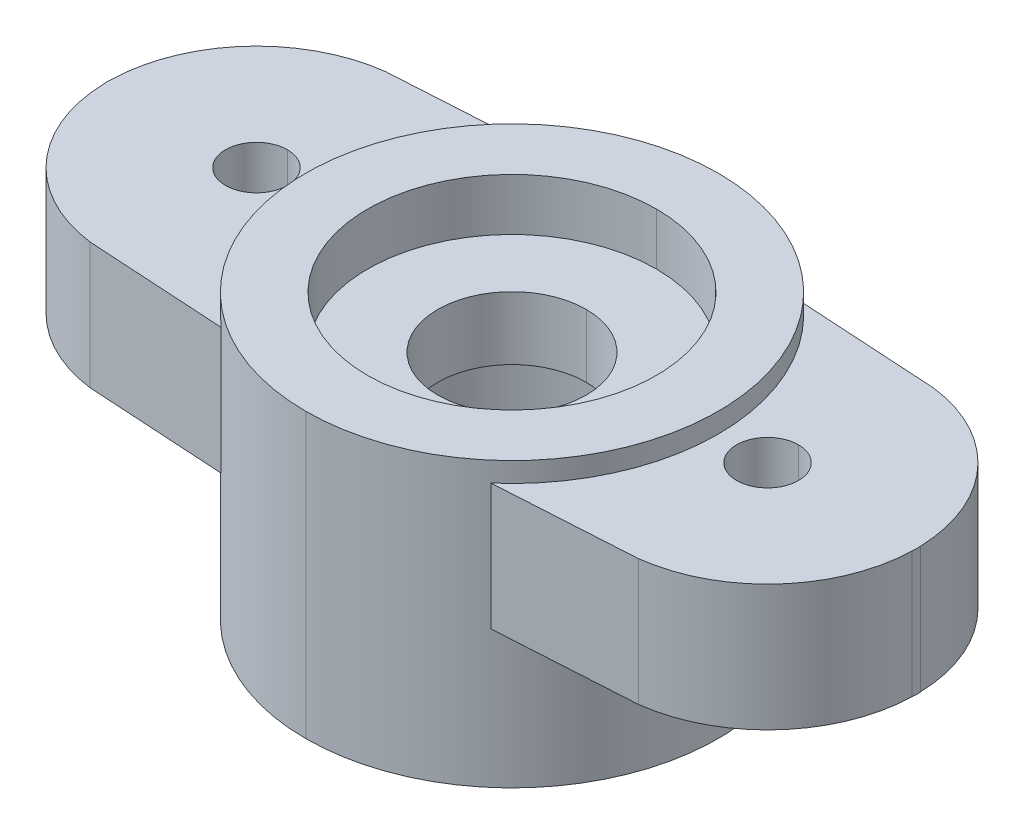
ISO-10303-21;
HEADER;
FILE_DESCRIPTION(('STEP AP214'),'2;1');
FILE_NAME('part.step','',(''),(''),'','','');
FILE_SCHEMA(('AUTOMOTIVE_DESIGN { 1 0 10303 214 1 1 1 1 }'));
ENDSEC;
DATA;
#1=APPLICATION_CONTEXT('core data for automotive mechanical design processes');
#2=APPLICATION_PROTOCOL_DEFINITION('international standard','automotive_design',2000,#1);
#3=PRODUCT_CONTEXT('',#1,'mechanical');
#4=PRODUCT('Part','Part','',(#3));
#5=PRODUCT_RELATED_PRODUCT_CATEGORY('part','',(#4));
#6=PRODUCT_DEFINITION_FORMATION('','',#4);
#7=PRODUCT_DEFINITION_CONTEXT('part definition',#1,'design');
#8=PRODUCT_DEFINITION('design','',#6,#7);
#9=PRODUCT_DEFINITION_SHAPE('','',#8);
#10=(LENGTH_UNIT() NAMED_UNIT(*) SI_UNIT(.MILLI.,.METRE.));
#11=(NAMED_UNIT(*) PLANE_ANGLE_UNIT() SI_UNIT($,.RADIAN.));
#12=(NAMED_UNIT(*) SI_UNIT($,.STERADIAN.) SOLID_ANGLE_UNIT());
#13=UNCERTAINTY_MEASURE_WITH_UNIT(LENGTH_MEASURE(1.E-05),#10,'distance_accuracy_value','');
#14=(GEOMETRIC_REPRESENTATION_CONTEXT(3) GLOBAL_UNCERTAINTY_ASSIGNED_CONTEXT((#13)) GLOBAL_UNIT_ASSIGNED_CONTEXT((#10,
#11,#12)) REPRESENTATION_CONTEXT('',''));
#15=CARTESIAN_POINT('',(0.,0.,0.));
#16=DIRECTION('',(0.,0.,1.));
#17=DIRECTION('',(1.,0.,0.));
#18=AXIS2_PLACEMENT_3D('',#15,#16,#17);
#19=CARTESIAN_POINT('',(0.,4.385,0.));
#20=DIRECTION('',(0.,1.,0.));
#21=DIRECTION('',(1.,0.,0.));
#22=AXIS2_PLACEMENT_3D('',#19,#20,#21);
#23=PLANE('',#22);
#24=CARTESIAN_POINT('',(6.214,4.385,0.));
#25=DIRECTION('',(0.,1.,0.));
#26=DIRECTION('',(0.,0.,1.));
#27=AXIS2_PLACEMENT_3D('',#24,#25,#26);
#28=CIRCLE('',#27,0.515);
#29=CARTESIAN_POINT('',(6.72414564496584,4.385,-0.0705437518309225));
#30=VERTEX_POINT('',#29);
#31=CARTESIAN_POINT('',(6.72414585993196,4.385,0.0705421972601265));
#32=VERTEX_POINT('',#31);
#33=EDGE_CURVE('E278',#30,#32,#28,.F.);
#34=ORIENTED_EDGE('',*,*,#33,.F.);
#35=CARTESIAN_POINT('',(4.25000001703469,4.385,2.99245565588309E-06));
#36=DIRECTION('',(0.,1.,0.));
#37=DIRECTION('',(0.,0.,1.));
#38=AXIS2_PLACEMENT_3D('',#35,#36,#37);
#39=CIRCLE('',#38,2.47515119363248);
#40=CARTESIAN_POINT('',(4.5607098838109,4.385,-2.45556879636018));
#41=VERTEX_POINT('',#40);
#42=EDGE_CURVE('E280',#41,#30,#39,.F.);
#43=ORIENTED_EDGE('',*,*,#42,.F.);
#44=DIRECTION('',(0.99819540210647,0.,0.0600494730493309));
#45=VECTOR('',#44,1.);
#46=CARTESIAN_POINT('',(0.163635156781981,4.385,-2.72008816777726));
#47=LINE('',#46,#45);
#48=CARTESIAN_POINT('',(2.24296121232624,4.385,-2.595));
#49=VERTEX_POINT('',#48);
#50=EDGE_CURVE('E343',#49,#41,#47,.T.);
#51=ORIENTED_EDGE('',*,*,#50,.F.);
#52=CARTESIAN_POINT('',(0.,4.385,0.));
#53=DIRECTION('',(0.,-1.,0.));
#54=DIRECTION('',(0.,0.,1.));
#55=AXIS2_PLACEMENT_3D('',#52,#53,#54);
#56=CIRCLE('',#55,3.43);
#57=CARTESIAN_POINT('',(2.24296121232624,4.385,2.595));
#58=VERTEX_POINT('',#57);
#59=EDGE_CURVE('E429',#49,#58,#56,.T.);
#60=ORIENTED_EDGE('',*,*,#59,.T.);
#61=DIRECTION('',(0.99819540210647,0.,-0.060049473049331));
#62=VECTOR('',#61,1.);
#63=CARTESIAN_POINT('',(0.163635156781981,4.385,2.72008816777726));
#64=LINE('',#63,#62);
#65=CARTESIAN_POINT('',(4.56080002723789,4.385,2.45556337350882));
#66=VERTEX_POINT('',#65);
#67=EDGE_CURVE('E349',#58,#66,#64,.T.);
#68=ORIENTED_EDGE('',*,*,#67,.T.);
#69=EDGE_CURVE('E85',#32,#66,#39,.F.);
#70=ORIENTED_EDGE('',*,*,#69,.F.);
#71=EDGE_LOOP('',(#34,#43,#51,#60,#68,#70));
#72=FACE_BOUND('',#71,.T.);
#73=CARTESIAN_POINT('',(4.25,4.385,0.));
#74=DIRECTION('',(0.,-1.,0.));
#75=DIRECTION('',(0.,0.,1.));
#76=AXIS2_PLACEMENT_3D('',#73,#74,#75);
#77=CIRCLE('',#76,0.515);
#78=CARTESIAN_POINT('',(4.25,4.385,0.515));
#79=VERTEX_POINT('',#78);
#80=CARTESIAN_POINT('',(4.25,4.385,-0.515));
#81=VERTEX_POINT('',#80);
#82=EDGE_CURVE('E367',#79,#81,#77,.T.);
#83=ORIENTED_EDGE('',*,*,#82,.T.);
#84=CARTESIAN_POINT('',(4.25,4.385,0.));
#85=DIRECTION('',(0.,-1.,0.));
#86=DIRECTION('',(0.,0.,1.));
#87=AXIS2_PLACEMENT_3D('',#84,#85,#86);
#88=CIRCLE('',#87,0.515);
#89=EDGE_CURVE('E400',#81,#79,#88,.T.);
#90=ORIENTED_EDGE('',*,*,#89,.T.);
#91=EDGE_LOOP('',(#83,#90));
#92=FACE_BOUND('',#91,.T.);
#93=ADVANCED_FACE('F67',(#72,#92),#23,.T.);
#94=CARTESIAN_POINT('',(0.,2.285,0.));
#95=DIRECTION('',(0.,1.,0.));
#96=DIRECTION('',(1.,0.,0.));
#97=AXIS2_PLACEMENT_3D('',#94,#95,#96);
#98=PLANE('',#97);
#99=CARTESIAN_POINT('',(4.25000001703469,2.285,2.99245565588309E-06));
#100=DIRECTION('',(0.,-1.,0.));
#101=DIRECTION('',(0.,0.,-1.));
#102=AXIS2_PLACEMENT_3D('',#99,#100,#101);
#103=CIRCLE('',#102,2.47515119363248);
#104=CARTESIAN_POINT('',(6.72414564496584,2.285,-0.0705437518309224));
#105=VERTEX_POINT('',#104);
#106=CARTESIAN_POINT('',(4.5607098838109,2.285,-2.45556879636018));
#107=VERTEX_POINT('',#106);
#108=EDGE_CURVE('E93',#105,#107,#103,.F.);
#109=ORIENTED_EDGE('',*,*,#108,.F.);
#110=CARTESIAN_POINT('',(6.214,2.285,0.));
#111=DIRECTION('',(0.,-1.,0.));
#112=DIRECTION('',(0.,0.,-1.));
#113=AXIS2_PLACEMENT_3D('',#110,#111,#112);
#114=CIRCLE('',#113,0.515);
#115=CARTESIAN_POINT('',(6.72414585993196,2.285,0.0705421972601265));
#116=VERTEX_POINT('',#115);
#117=EDGE_CURVE('E276',#105,#116,#114,.T.);
#118=ORIENTED_EDGE('',*,*,#117,.T.);
#119=CARTESIAN_POINT('',(4.56080002723787,2.285,2.45556337350883));
#120=VERTEX_POINT('',#119);
#121=EDGE_CURVE('E261',#120,#116,#103,.F.);
#122=ORIENTED_EDGE('',*,*,#121,.F.);
#123=DIRECTION('',(0.99819540210647,0.,-0.060049473049331));
#124=VECTOR('',#123,1.);
#125=CARTESIAN_POINT('',(0.163635156781981,2.285,2.72008816777726));
#126=LINE('',#125,#124);
#127=CARTESIAN_POINT('',(2.24296121232624,2.285,2.595));
#128=VERTEX_POINT('',#127);
#129=EDGE_CURVE('E355',#128,#120,#126,.T.);
#130=ORIENTED_EDGE('',*,*,#129,.F.);
#131=CARTESIAN_POINT('',(0.,2.285,0.));
#132=DIRECTION('',(0.,-1.,0.));
#133=DIRECTION('',(0.,0.,1.));
#134=AXIS2_PLACEMENT_3D('',#131,#132,#133);
#135=CIRCLE('',#134,3.43);
#136=CARTESIAN_POINT('',(2.24296121232624,2.285,-2.595));
#137=VERTEX_POINT('',#136);
#138=EDGE_CURVE('E347',#137,#128,#135,.T.);
#139=ORIENTED_EDGE('',*,*,#138,.F.);
#140=DIRECTION('',(0.99819540210647,0.,0.0600494730493309));
#141=VECTOR('',#140,1.);
#142=CARTESIAN_POINT('',(0.163635156781981,2.285,-2.72008816777726));
#143=LINE('',#142,#141);
#144=EDGE_CURVE('E341',#137,#107,#143,.T.);
#145=ORIENTED_EDGE('',*,*,#144,.T.);
#146=EDGE_LOOP('',(#109,#118,#122,#130,#139,#145));
#147=FACE_BOUND('',#146,.T.);
#148=CARTESIAN_POINT('',(4.25,2.285,0.));
#149=DIRECTION('',(0.,-1.,0.));
#150=DIRECTION('',(0.,0.,1.));
#151=AXIS2_PLACEMENT_3D('',#148,#149,#150);
#152=CIRCLE('',#151,0.515);
#153=CARTESIAN_POINT('',(4.25,2.285,0.515));
#154=VERTEX_POINT('',#153);
#155=CARTESIAN_POINT('',(4.25,2.285,-0.515));
#156=VERTEX_POINT('',#155);
#157=EDGE_CURVE('E368',#154,#156,#152,.T.);
#158=ORIENTED_EDGE('',*,*,#157,.F.);
#159=CARTESIAN_POINT('',(4.25,2.285,0.));
#160=DIRECTION('',(0.,-1.,0.));
#161=DIRECTION('',(0.,0.,1.));
#162=AXIS2_PLACEMENT_3D('',#159,#160,#161);
#163=CIRCLE('',#162,0.515);
#164=EDGE_CURVE('E407',#156,#154,#163,.T.);
#165=ORIENTED_EDGE('',*,*,#164,.F.);
#166=EDGE_LOOP('',(#158,#165));
#167=FACE_BOUND('',#166,.T.);
#168=ADVANCED_FACE('F282',(#147,#167),#98,.F.);
#169=CARTESIAN_POINT('',(0.,4.385,0.));
#170=DIRECTION('',(0.,1.,0.));
#171=DIRECTION('',(1.,0.,0.));
#172=AXIS2_PLACEMENT_3D('',#169,#170,#171);
#173=PLANE('',#172);
#174=CARTESIAN_POINT('',(-4.25000001703468,4.385,2.99245565414837E-06));
#175=DIRECTION('',(0.,1.,0.));
#176=DIRECTION('',(0.,0.,1.));
#177=AXIS2_PLACEMENT_3D('',#174,#175,#176);
#178=CIRCLE('',#177,2.47515119363248);
#179=CARTESIAN_POINT('',(-4.56070988381089,4.385,-2.45556879636018));
#180=VERTEX_POINT('',#179);
#181=CARTESIAN_POINT('',(-6.72414564496584,4.385,-0.0705437518309338));
#182=VERTEX_POINT('',#181);
#183=EDGE_CURVE('E308',#180,#182,#178,.T.);
#184=ORIENTED_EDGE('',*,*,#183,.T.);
#185=CARTESIAN_POINT('',(-6.214,4.385,0.));
#186=DIRECTION('',(0.,1.,0.));
#187=DIRECTION('',(0.,0.,1.));
#188=AXIS2_PLACEMENT_3D('',#185,#186,#187);
#189=CIRCLE('',#188,0.515);
#190=CARTESIAN_POINT('',(-6.72414585993196,4.385,0.0705421972601396));
#191=VERTEX_POINT('',#190);
#192=EDGE_CURVE('E296',#191,#182,#189,.F.);
#193=ORIENTED_EDGE('',*,*,#192,.F.);
#194=CARTESIAN_POINT('',(-4.25000001703468,4.385,2.99245565414837E-06));
#195=DIRECTION('',(0.,1.,0.));
#196=DIRECTION('',(0.,0.,1.));
#197=AXIS2_PLACEMENT_3D('',#194,#195,#196);
#198=CIRCLE('',#197,2.47515119363248);
#199=CARTESIAN_POINT('',(-4.56080002723784,4.385,2.45556337350883));
#200=VERTEX_POINT('',#199);
#201=EDGE_CURVE('E323',#191,#200,#198,.T.);
#202=ORIENTED_EDGE('',*,*,#201,.T.);
#203=DIRECTION('',(-0.99819540210647,0.,-0.060049473049331));
#204=VECTOR('',#203,1.);
#205=CARTESIAN_POINT('',(-0.163635156781981,4.385,2.72008816777726));
#206=LINE('',#205,#204);
#207=CARTESIAN_POINT('',(-2.24296121232624,4.385,2.595));
#208=VERTEX_POINT('',#207);
#209=EDGE_CURVE('E383',#208,#200,#206,.T.);
#210=ORIENTED_EDGE('',*,*,#209,.F.);
#211=CARTESIAN_POINT('',(0.,4.385,0.));
#212=DIRECTION('',(0.,1.,0.));
#213=DIRECTION('',(0.,0.,1.));
#214=AXIS2_PLACEMENT_3D('',#211,#212,#213);
#215=CIRCLE('',#214,3.43);
#216=CARTESIAN_POINT('',(-2.24296121232624,4.385,-2.595));
#217=VERTEX_POINT('',#216);
#218=EDGE_CURVE('E419',#217,#208,#215,.T.);
#219=ORIENTED_EDGE('',*,*,#218,.F.);
#220=DIRECTION('',(-0.99819540210647,0.,0.0600494730493309));
#221=VECTOR('',#220,1.);
#222=CARTESIAN_POINT('',(-0.163635156781981,4.385,-2.72008816777726));
#223=LINE('',#222,#221);
#224=EDGE_CURVE('E369',#217,#180,#223,.T.);
#225=ORIENTED_EDGE('',*,*,#224,.T.);
#226=EDGE_LOOP('',(#184,#193,#202,#210,#219,#225));
#227=FACE_BOUND('',#226,.T.);
#228=CARTESIAN_POINT('',(-4.25,4.385,0.));
#229=DIRECTION('',(0.,1.,0.));
#230=DIRECTION('',(0.,0.,1.));
#231=AXIS2_PLACEMENT_3D('',#228,#229,#230);
#232=CIRCLE('',#231,0.515);
#233=CARTESIAN_POINT('',(-4.25,4.385,0.515));
#234=VERTEX_POINT('',#233);
#235=CARTESIAN_POINT('',(-4.25,4.385,-0.515));
#236=VERTEX_POINT('',#235);
#237=EDGE_CURVE('E357',#234,#236,#232,.T.);
#238=ORIENTED_EDGE('',*,*,#237,.F.);
#239=CARTESIAN_POINT('',(-4.25,4.385,0.));
#240=DIRECTION('',(0.,1.,0.));
#241=DIRECTION('',(0.,0.,1.));
#242=AXIS2_PLACEMENT_3D('',#239,#240,#241);
#243=CIRCLE('',#242,0.515);
#244=EDGE_CURVE('E417',#236,#234,#243,.T.);
#245=ORIENTED_EDGE('',*,*,#244,.F.);
#246=EDGE_LOOP('',(#238,#245));
#247=FACE_BOUND('',#246,.T.);
#248=ADVANCED_FACE('F576',(#227,#247),#173,.T.);
#249=CARTESIAN_POINT('',(0.,2.285,0.));
#250=DIRECTION('',(0.,1.,0.));
#251=DIRECTION('',(1.,0.,0.));
#252=AXIS2_PLACEMENT_3D('',#249,#250,#251);
#253=PLANE('',#252);
#254=CARTESIAN_POINT('',(-6.214,2.285,0.));
#255=DIRECTION('',(0.,-1.,0.));
#256=DIRECTION('',(0.,0.,-1.));
#257=AXIS2_PLACEMENT_3D('',#254,#255,#256);
#258=CIRCLE('',#257,0.515);
#259=CARTESIAN_POINT('',(-6.72414585993196,2.285,0.0705421972601426));
#260=VERTEX_POINT('',#259);
#261=CARTESIAN_POINT('',(-6.72414564496584,2.285,-0.0705437518309338));
#262=VERTEX_POINT('',#261);
#263=EDGE_CURVE('E288',#260,#262,#258,.T.);
#264=ORIENTED_EDGE('',*,*,#263,.T.);
#265=CARTESIAN_POINT('',(-4.25000001703468,2.285,2.99245565414837E-06));
#266=DIRECTION('',(0.,-1.,0.));
#267=DIRECTION('',(0.,0.,-1.));
#268=AXIS2_PLACEMENT_3D('',#265,#266,#267);
#269=CIRCLE('',#268,2.47515119363248);
#270=CARTESIAN_POINT('',(-4.56070988381089,2.285,-2.45556879636018));
#271=VERTEX_POINT('',#270);
#272=EDGE_CURVE('E303',#262,#271,#269,.T.);
#273=ORIENTED_EDGE('',*,*,#272,.T.);
#274=DIRECTION('',(-0.99819540210647,0.,0.0600494730493309));
#275=VECTOR('',#274,1.);
#276=CARTESIAN_POINT('',(-0.163635156781981,2.285,-2.72008816777726));
#277=LINE('',#276,#275);
#278=CARTESIAN_POINT('',(-2.24296121232624,2.285,-2.595));
#279=VERTEX_POINT('',#278);
#280=EDGE_CURVE('E373',#279,#271,#277,.T.);
#281=ORIENTED_EDGE('',*,*,#280,.F.);
#282=CARTESIAN_POINT('',(0.,2.285,0.));
#283=DIRECTION('',(0.,1.,0.));
#284=DIRECTION('',(0.,0.,1.));
#285=AXIS2_PLACEMENT_3D('',#282,#283,#284);
#286=CIRCLE('',#285,3.43);
#287=CARTESIAN_POINT('',(-2.24296121232624,2.285,2.595));
#288=VERTEX_POINT('',#287);
#289=EDGE_CURVE('E411',#279,#288,#286,.T.);
#290=ORIENTED_EDGE('',*,*,#289,.T.);
#291=DIRECTION('',(-0.99819540210647,0.,-0.060049473049331));
#292=VECTOR('',#291,1.);
#293=CARTESIAN_POINT('',(-0.163635156781981,2.285,2.72008816777726));
#294=LINE('',#293,#292);
#295=CARTESIAN_POINT('',(-4.56080002723784,2.285,2.45556337350883));
#296=VERTEX_POINT('',#295);
#297=EDGE_CURVE('E374',#288,#296,#294,.T.);
#298=ORIENTED_EDGE('',*,*,#297,.T.);
#299=EDGE_CURVE('E299',#296,#260,#269,.T.);
#300=ORIENTED_EDGE('',*,*,#299,.T.);
#301=EDGE_LOOP('',(#264,#273,#281,#290,#298,#300));
#302=FACE_BOUND('',#301,.T.);
#303=CARTESIAN_POINT('',(-4.25,2.285,0.));
#304=DIRECTION('',(0.,1.,0.));
#305=DIRECTION('',(0.,0.,1.));
#306=AXIS2_PLACEMENT_3D('',#303,#304,#305);
#307=CIRCLE('',#306,0.515);
#308=CARTESIAN_POINT('',(-4.25,2.285,0.515));
#309=VERTEX_POINT('',#308);
#310=CARTESIAN_POINT('',(-4.25,2.285,-0.515));
#311=VERTEX_POINT('',#310);
#312=EDGE_CURVE('E448',#309,#311,#307,.T.);
#313=ORIENTED_EDGE('',*,*,#312,.T.);
#314=CARTESIAN_POINT('',(-4.25,2.285,0.));
#315=DIRECTION('',(0.,1.,0.));
#316=DIRECTION('',(0.,0.,1.));
#317=AXIS2_PLACEMENT_3D('',#314,#315,#316);
#318=CIRCLE('',#317,0.515);
#319=EDGE_CURVE('E418',#311,#309,#318,.T.);
#320=ORIENTED_EDGE('',*,*,#319,.T.);
#321=EDGE_LOOP('',(#313,#320));
#322=FACE_BOUND('',#321,.T.);
#323=ADVANCED_FACE('F623',(#302,#322),#253,.F.);
#324=CARTESIAN_POINT('',(-0.163635156781981,2.285,2.72008816777726));
#325=DIRECTION('',(0.060049473049331,0.,-0.99819540210647));
#326=DIRECTION('',(0.,-1.,0.));
#327=AXIS2_PLACEMENT_3D('',#324,#325,#326);
#328=PLANE('',#327);
#329=DIRECTION('',(0.,-1.,0.));
#330=VECTOR('',#329,1.);
#331=CARTESIAN_POINT('',(-4.56080002723784,4.715,2.45556337350883));
#332=LINE('',#331,#330);
#333=EDGE_CURVE('E309',#200,#296,#332,.T.);
#334=ORIENTED_EDGE('',*,*,#333,.T.);
#335=ORIENTED_EDGE('',*,*,#297,.F.);
#336=DIRECTION('',(0.,1.,0.));
#337=VECTOR('',#336,1.);
#338=CARTESIAN_POINT('',(-2.24296121232624,2.285,2.595));
#339=LINE('',#338,#337);
#340=EDGE_CURVE('E423',#288,#208,#339,.T.);
#341=ORIENTED_EDGE('',*,*,#340,.T.);
#342=ORIENTED_EDGE('',*,*,#209,.T.);
#343=EDGE_LOOP('',(#334,#335,#341,#342));
#344=FACE_BOUND('',#343,.T.);
#345=ADVANCED_FACE('F69',(#344),#328,.F.);
#346=CARTESIAN_POINT('',(-0.163635156781981,2.285,-2.72008816777726));
#347=DIRECTION('',(-0.0600494730493309,0.,-0.99819540210647));
#348=DIRECTION('',(-0.99819540210647,0.,0.0600494730493309));
#349=AXIS2_PLACEMENT_3D('',#346,#347,#348);
#350=PLANE('',#349);
#351=ORIENTED_EDGE('',*,*,#280,.T.);
#352=DIRECTION('',(0.,-1.,0.));
#353=VECTOR('',#352,1.);
#354=CARTESIAN_POINT('',(-4.56070988381089,4.715,-2.45556879636018));
#355=LINE('',#354,#353);
#356=EDGE_CURVE('E305',#180,#271,#355,.T.);
#357=ORIENTED_EDGE('',*,*,#356,.F.);
#358=ORIENTED_EDGE('',*,*,#224,.F.);
#359=DIRECTION('',(0.,1.,0.));
#360=VECTOR('',#359,1.);
#361=CARTESIAN_POINT('',(-2.24296121232624,2.285,-2.595));
#362=LINE('',#361,#360);
#363=EDGE_CURVE('E424',#279,#217,#362,.T.);
#364=ORIENTED_EDGE('',*,*,#363,.F.);
#365=EDGE_LOOP('',(#351,#357,#358,#364));
#366=FACE_BOUND('',#365,.T.);
#367=ADVANCED_FACE('F718',(#366),#350,.T.);
#368=CARTESIAN_POINT('',(0.,2.8,0.));
#369=DIRECTION('',(0.,-1.,0.));
#370=DIRECTION('',(0.,0.,-1.));
#371=AXIS2_PLACEMENT_3D('',#368,#369,#370);
#372=PLANE('',#371);
#373=CARTESIAN_POINT('',(0.,2.8,0.));
#374=DIRECTION('',(0.,-1.,0.));
#375=DIRECTION('',(0.,0.,-1.));
#376=AXIS2_PLACEMENT_3D('',#373,#374,#375);
#377=CIRCLE('',#376,1.235);
#378=CARTESIAN_POINT('',(0.,2.8,-1.235));
#379=VERTEX_POINT('',#378);
#380=CARTESIAN_POINT('',(0.,2.8,1.235));
#381=VERTEX_POINT('',#380);
#382=EDGE_CURVE('E361',#379,#381,#377,.T.);
#383=ORIENTED_EDGE('',*,*,#382,.F.);
#384=CARTESIAN_POINT('',(0.,2.8,0.));
#385=DIRECTION('',(0.,-1.,0.));
#386=DIRECTION('',(0.,0.,-1.));
#387=AXIS2_PLACEMENT_3D('',#384,#385,#386);
#388=CIRCLE('',#387,1.235);
#389=EDGE_CURVE('E484',#381,#379,#388,.T.);
#390=ORIENTED_EDGE('',*,*,#389,.F.);
#391=EDGE_LOOP('',(#383,#390));
#392=FACE_BOUND('',#391,.T.);
#393=CARTESIAN_POINT('',(0.,2.8,0.));
#394=DIRECTION('',(0.,-1.,0.));
#395=DIRECTION('',(0.,0.,-1.));
#396=AXIS2_PLACEMENT_3D('',#393,#394,#395);
#397=CIRCLE('',#396,2.345);
#398=CARTESIAN_POINT('',(0.,2.8,-2.345));
#399=VERTEX_POINT('',#398);
#400=CARTESIAN_POINT('',(0.,2.8,2.345));
#401=VERTEX_POINT('',#400);
#402=EDGE_CURVE('E395',#399,#401,#397,.T.);
#403=ORIENTED_EDGE('',*,*,#402,.T.);
#404=CARTESIAN_POINT('',(0.,2.8,0.));
#405=DIRECTION('',(0.,-1.,0.));
#406=DIRECTION('',(0.,0.,-1.));
#407=AXIS2_PLACEMENT_3D('',#404,#405,#406);
#408=CIRCLE('',#407,2.345);
#409=EDGE_CURVE('E444',#401,#399,#408,.T.);
#410=ORIENTED_EDGE('',*,*,#409,.T.);
#411=EDGE_LOOP('',(#403,#410));
#412=FACE_BOUND('',#411,.T.);
#413=ADVANCED_FACE('F580',(#392,#412),#372,.T.);
#414=CARTESIAN_POINT('',(0.,2.8,0.));
#415=DIRECTION('',(0.,-1.,0.));
#416=DIRECTION('',(0.,0.,-1.));
#417=AXIS2_PLACEMENT_3D('',#414,#415,#416);
#418=CYLINDRICAL_SURFACE('',#417,2.345);
#419=DIRECTION('',(0.,-1.,0.));
#420=VECTOR('',#419,1.);
#421=CARTESIAN_POINT('',(0.,2.8,2.345));
#422=LINE('',#421,#420);
#423=CARTESIAN_POINT('',(0.,0.,2.345));
#424=VERTEX_POINT('',#423);
#425=EDGE_CURVE('E440',#401,#424,#422,.T.);
#426=ORIENTED_EDGE('',*,*,#425,.F.);
#427=ORIENTED_EDGE('',*,*,#402,.F.);
#428=DIRECTION('',(0.,-1.,0.));
#429=VECTOR('',#428,1.);
#430=CARTESIAN_POINT('',(0.,2.8,-2.345));
#431=LINE('',#430,#429);
#432=CARTESIAN_POINT('',(0.,0.,-2.345));
#433=VERTEX_POINT('',#432);
#434=EDGE_CURVE('E375',#399,#433,#431,.T.);
#435=ORIENTED_EDGE('',*,*,#434,.T.);
#436=CARTESIAN_POINT('',(0.,0.,0.));
#437=DIRECTION('',(0.,-1.,0.));
#438=DIRECTION('',(0.,0.,-1.));
#439=AXIS2_PLACEMENT_3D('',#436,#437,#438);
#440=CIRCLE('',#439,2.345);
#441=EDGE_CURVE('E460',#433,#424,#440,.T.);
#442=ORIENTED_EDGE('',*,*,#441,.T.);
#443=EDGE_LOOP('',(#426,#427,#435,#442));
#444=FACE_BOUND('',#443,.T.);
#445=ADVANCED_FACE('F717',(#444),#418,.F.);
#446=CARTESIAN_POINT('',(4.25,2.285,0.));
#447=DIRECTION('',(0.,1.,0.));
#448=DIRECTION('',(0.,0.,1.));
#449=AXIS2_PLACEMENT_3D('',#446,#447,#448);
#450=CYLINDRICAL_SURFACE('',#449,0.515);
#451=DIRECTION('',(0.,1.,0.));
#452=VECTOR('',#451,1.);
#453=CARTESIAN_POINT('',(4.25,2.285,-0.515));
#454=LINE('',#453,#452);
#455=EDGE_CURVE('E363',#156,#81,#454,.T.);
#456=ORIENTED_EDGE('',*,*,#455,.F.);
#457=ORIENTED_EDGE('',*,*,#164,.T.);
#458=DIRECTION('',(0.,1.,0.));
#459=VECTOR('',#458,1.);
#460=CARTESIAN_POINT('',(4.25,2.285,0.515));
#461=LINE('',#460,#459);
#462=EDGE_CURVE('E387',#154,#79,#461,.T.);
#463=ORIENTED_EDGE('',*,*,#462,.T.);
#464=ORIENTED_EDGE('',*,*,#89,.F.);
#465=EDGE_LOOP('',(#456,#457,#463,#464));
#466=FACE_BOUND('',#465,.T.);
#467=ADVANCED_FACE('F605',(#466),#450,.F.);
#468=CARTESIAN_POINT('',(0.163635156781981,2.285,2.72008816777726));
#469=DIRECTION('',(0.060049473049331,0.,0.99819540210647));
#470=DIRECTION('',(0.,-1.,0.));
#471=AXIS2_PLACEMENT_3D('',#468,#469,#470);
#472=PLANE('',#471);
#473=DIRECTION('',(0.,-1.,0.));
#474=VECTOR('',#473,1.);
#475=CARTESIAN_POINT('',(4.56080002723787,4.715,2.45556337350883));
#476=LINE('',#475,#474);
#477=EDGE_CURVE('E265',#66,#120,#476,.T.);
#478=ORIENTED_EDGE('',*,*,#477,.F.);
#479=ORIENTED_EDGE('',*,*,#67,.F.);
#480=DIRECTION('',(0.,1.,0.));
#481=VECTOR('',#480,1.);
#482=CARTESIAN_POINT('',(2.24296121232624,2.285,2.595));
#483=LINE('',#482,#481);
#484=EDGE_CURVE('E467',#128,#58,#483,.T.);
#485=ORIENTED_EDGE('',*,*,#484,.F.);
#486=ORIENTED_EDGE('',*,*,#129,.T.);
#487=EDGE_LOOP('',(#478,#479,#485,#486));
#488=FACE_BOUND('',#487,.T.);
#489=ADVANCED_FACE('F550',(#488),#472,.T.);
#490=CARTESIAN_POINT('',(0.163635156781981,2.285,-2.72008816777726));
#491=DIRECTION('',(-0.0600494730493309,0.,0.99819540210647));
#492=DIRECTION('',(0.,1.,0.));
#493=AXIS2_PLACEMENT_3D('',#490,#491,#492);
#494=PLANE('',#493);
#495=ORIENTED_EDGE('',*,*,#50,.T.);
#496=DIRECTION('',(0.,-1.,0.));
#497=VECTOR('',#496,1.);
#498=CARTESIAN_POINT('',(4.5607098838109,4.715,-2.45556879636018));
#499=LINE('',#498,#497);
#500=EDGE_CURVE('E304',#41,#107,#499,.T.);
#501=ORIENTED_EDGE('',*,*,#500,.T.);
#502=ORIENTED_EDGE('',*,*,#144,.F.);
#503=DIRECTION('',(0.,1.,0.));
#504=VECTOR('',#503,1.);
#505=CARTESIAN_POINT('',(2.24296121232624,2.285,-2.595));
#506=LINE('',#505,#504);
#507=EDGE_CURVE('E425',#137,#49,#506,.T.);
#508=ORIENTED_EDGE('',*,*,#507,.T.);
#509=EDGE_LOOP('',(#495,#501,#502,#508));
#510=FACE_BOUND('',#509,.T.);
#511=ADVANCED_FACE('F339',(#510),#494,.F.);
#512=CARTESIAN_POINT('',(-4.25,2.285,0.));
#513=DIRECTION('',(0.,1.,0.));
#514=DIRECTION('',(0.,0.,1.));
#515=AXIS2_PLACEMENT_3D('',#512,#513,#514);
#516=CYLINDRICAL_SURFACE('',#515,0.515);
#517=DIRECTION('',(0.,1.,0.));
#518=VECTOR('',#517,1.);
#519=CARTESIAN_POINT('',(-4.25,2.285,-0.515));
#520=LINE('',#519,#518);
#521=EDGE_CURVE('E413',#311,#236,#520,.T.);
#522=ORIENTED_EDGE('',*,*,#521,.F.);
#523=ORIENTED_EDGE('',*,*,#312,.F.);
#524=DIRECTION('',(0.,1.,0.));
#525=VECTOR('',#524,1.);
#526=CARTESIAN_POINT('',(-4.25,2.285,0.515));
#527=LINE('',#526,#525);
#528=EDGE_CURVE('E503',#309,#234,#527,.T.);
#529=ORIENTED_EDGE('',*,*,#528,.T.);
#530=ORIENTED_EDGE('',*,*,#237,.T.);
#531=EDGE_LOOP('',(#522,#523,#529,#530));
#532=FACE_BOUND('',#531,.T.);
#533=ADVANCED_FACE('F592',(#532),#516,.F.);
#534=CARTESIAN_POINT('',(0.,3.85,0.));
#535=DIRECTION('',(0.,1.,0.));
#536=DIRECTION('',(1.,0.,0.));
#537=AXIS2_PLACEMENT_3D('',#534,#535,#536);
#538=PLANE('',#537);
#539=CARTESIAN_POINT('',(0.,3.85,0.));
#540=DIRECTION('',(0.,1.,0.));
#541=DIRECTION('',(0.,0.,1.));
#542=AXIS2_PLACEMENT_3D('',#539,#540,#541);
#543=CIRCLE('',#542,1.235);
#544=CARTESIAN_POINT('',(0.,3.85,-1.235));
#545=VERTEX_POINT('',#544);
#546=CARTESIAN_POINT('',(0.,3.85,1.235));
#547=VERTEX_POINT('',#546);
#548=EDGE_CURVE('E428',#545,#547,#543,.T.);
#549=ORIENTED_EDGE('',*,*,#548,.F.);
#550=CARTESIAN_POINT('',(0.,3.85,0.));
#551=DIRECTION('',(0.,1.,0.));
#552=DIRECTION('',(0.,0.,1.));
#553=AXIS2_PLACEMENT_3D('',#550,#551,#552);
#554=CIRCLE('',#553,1.235);
#555=EDGE_CURVE('E520',#547,#545,#554,.T.);
#556=ORIENTED_EDGE('',*,*,#555,.F.);
#557=EDGE_LOOP('',(#549,#556));
#558=FACE_BOUND('',#557,.T.);
#559=CARTESIAN_POINT('',(0.,3.85,0.));
#560=DIRECTION('',(0.,1.,0.));
#561=DIRECTION('',(0.,0.,1.));
#562=AXIS2_PLACEMENT_3D('',#559,#560,#561);
#563=CIRCLE('',#562,2.4);
#564=CARTESIAN_POINT('',(0.,3.85,2.4));
#565=VERTEX_POINT('',#564);
#566=CARTESIAN_POINT('',(0.,3.85,-2.4));
#567=VERTEX_POINT('',#566);
#568=EDGE_CURVE('E463',#565,#567,#563,.T.);
#569=ORIENTED_EDGE('',*,*,#568,.T.);
#570=CARTESIAN_POINT('',(0.,3.85,0.));
#571=DIRECTION('',(0.,1.,0.));
#572=DIRECTION('',(0.,0.,1.));
#573=AXIS2_PLACEMENT_3D('',#570,#571,#572);
#574=CIRCLE('',#573,2.4);
#575=EDGE_CURVE('E507',#567,#565,#574,.T.);
#576=ORIENTED_EDGE('',*,*,#575,.T.);
#577=EDGE_LOOP('',(#569,#576));
#578=FACE_BOUND('',#577,.T.);
#579=ADVANCED_FACE('F588',(#558,#578),#538,.T.);
#580=CARTESIAN_POINT('',(0.,3.85,0.));
#581=DIRECTION('',(0.,1.,0.));
#582=DIRECTION('',(0.,0.,1.));
#583=AXIS2_PLACEMENT_3D('',#580,#581,#582);
#584=CYLINDRICAL_SURFACE('',#583,2.4);
#585=DIRECTION('',(0.,1.,0.));
#586=VECTOR('',#585,1.);
#587=CARTESIAN_POINT('',(0.,3.85,-2.4));
#588=LINE('',#587,#586);
#589=CARTESIAN_POINT('',(0.,4.715,-2.4));
#590=VERTEX_POINT('',#589);
#591=EDGE_CURVE('E531',#567,#590,#588,.T.);
#592=ORIENTED_EDGE('',*,*,#591,.F.);
#593=ORIENTED_EDGE('',*,*,#568,.F.);
#594=DIRECTION('',(0.,1.,0.));
#595=VECTOR('',#594,1.);
#596=CARTESIAN_POINT('',(0.,3.85,2.4));
#597=LINE('',#596,#595);
#598=CARTESIAN_POINT('',(0.,4.715,2.4));
#599=VERTEX_POINT('',#598);
#600=EDGE_CURVE('E430',#565,#599,#597,.T.);
#601=ORIENTED_EDGE('',*,*,#600,.T.);
#602=CARTESIAN_POINT('',(0.,4.715,0.));
#603=DIRECTION('',(0.,1.,0.));
#604=DIRECTION('',(0.,0.,1.));
#605=AXIS2_PLACEMENT_3D('',#602,#603,#604);
#606=CIRCLE('',#605,2.4);
#607=EDGE_CURVE('E464',#599,#590,#606,.T.);
#608=ORIENTED_EDGE('',*,*,#607,.T.);
#609=EDGE_LOOP('',(#592,#593,#601,#608));
#610=FACE_BOUND('',#609,.T.);
#611=ADVANCED_FACE('F591',(#610),#584,.F.);
#612=CARTESIAN_POINT('',(0.,0.,0.));
#613=DIRECTION('',(0.,1.,0.));
#614=DIRECTION('',(1.,0.,0.));
#615=AXIS2_PLACEMENT_3D('',#612,#613,#614);
#616=PLANE('',#615);
#617=ORIENTED_EDGE('',*,*,#441,.F.);
#618=CARTESIAN_POINT('',(0.,0.,0.));
#619=DIRECTION('',(0.,-1.,0.));
#620=DIRECTION('',(0.,0.,-1.));
#621=AXIS2_PLACEMENT_3D('',#618,#619,#620);
#622=CIRCLE('',#621,2.345);
#623=EDGE_CURVE('E379',#424,#433,#622,.T.);
#624=ORIENTED_EDGE('',*,*,#623,.F.);
#625=EDGE_LOOP('',(#617,#624));
#626=FACE_BOUND('',#625,.T.);
#627=CARTESIAN_POINT('',(0.,0.,0.));
#628=DIRECTION('',(0.,1.,0.));
#629=DIRECTION('',(0.,0.,1.));
#630=AXIS2_PLACEMENT_3D('',#627,#628,#629);
#631=CIRCLE('',#630,3.43);
#632=CARTESIAN_POINT('',(0.,0.,-3.43));
#633=VERTEX_POINT('',#632);
#634=CARTESIAN_POINT('',(0.,0.,3.43));
#635=VERTEX_POINT('',#634);
#636=EDGE_CURVE('E487',#633,#635,#631,.T.);
#637=ORIENTED_EDGE('',*,*,#636,.F.);
#638=CARTESIAN_POINT('',(0.,0.,0.));
#639=DIRECTION('',(0.,1.,0.));
#640=DIRECTION('',(0.,0.,1.));
#641=AXIS2_PLACEMENT_3D('',#638,#639,#640);
#642=CIRCLE('',#641,3.43);
#643=EDGE_CURVE('E392',#635,#633,#642,.T.);
#644=ORIENTED_EDGE('',*,*,#643,.F.);
#645=EDGE_LOOP('',(#637,#644));
#646=FACE_BOUND('',#645,.T.);
#647=ADVANCED_FACE('F586',(#626,#646),#616,.F.);
#648=CARTESIAN_POINT('',(0.,4.715,0.));
#649=DIRECTION('',(0.,1.,0.));
#650=DIRECTION('',(1.,0.,0.));
#651=AXIS2_PLACEMENT_3D('',#648,#649,#650);
#652=PLANE('',#651);
#653=ORIENTED_EDGE('',*,*,#607,.F.);
#654=CARTESIAN_POINT('',(0.,4.715,0.));
#655=DIRECTION('',(0.,1.,0.));
#656=DIRECTION('',(0.,0.,1.));
#657=AXIS2_PLACEMENT_3D('',#654,#655,#656);
#658=CIRCLE('',#657,2.4);
#659=EDGE_CURVE('E435',#590,#599,#658,.T.);
#660=ORIENTED_EDGE('',*,*,#659,.F.);
#661=EDGE_LOOP('',(#653,#660));
#662=FACE_BOUND('',#661,.T.);
#663=CARTESIAN_POINT('',(0.,4.715,0.));
#664=DIRECTION('',(0.,1.,0.));
#665=DIRECTION('',(0.,0.,1.));
#666=AXIS2_PLACEMENT_3D('',#663,#664,#665);
#667=CIRCLE('',#666,3.43);
#668=CARTESIAN_POINT('',(0.,4.715,-3.43));
#669=VERTEX_POINT('',#668);
#670=CARTESIAN_POINT('',(0.,4.715,3.43));
#671=VERTEX_POINT('',#670);
#672=EDGE_CURVE('E490',#669,#671,#667,.T.);
#673=ORIENTED_EDGE('',*,*,#672,.T.);
#674=CARTESIAN_POINT('',(0.,4.715,0.));
#675=DIRECTION('',(0.,1.,0.));
#676=DIRECTION('',(0.,0.,1.));
#677=AXIS2_PLACEMENT_3D('',#674,#675,#676);
#678=CIRCLE('',#677,3.43);
#679=EDGE_CURVE('E434',#671,#669,#678,.T.);
#680=ORIENTED_EDGE('',*,*,#679,.T.);
#681=EDGE_LOOP('',(#673,#680));
#682=FACE_BOUND('',#681,.T.);
#683=ADVANCED_FACE('F582',(#662,#682),#652,.T.);
#684=CARTESIAN_POINT('',(0.,4.715,0.));
#685=DIRECTION('',(0.,-1.,0.));
#686=DIRECTION('',(0.,0.,-1.));
#687=AXIS2_PLACEMENT_3D('',#684,#685,#686);
#688=CYLINDRICAL_SURFACE('',#687,3.43);
#689=ORIENTED_EDGE('',*,*,#289,.F.);
#690=ORIENTED_EDGE('',*,*,#363,.T.);
#691=ORIENTED_EDGE('',*,*,#218,.T.);
#692=ORIENTED_EDGE('',*,*,#340,.F.);
#693=EDGE_LOOP('',(#689,#690,#691,#692));
#694=FACE_BOUND('',#693,.T.);
#695=DIRECTION('',(0.,-1.,0.));
#696=VECTOR('',#695,1.);
#697=CARTESIAN_POINT('',(0.,4.715,3.43));
#698=LINE('',#697,#696);
#699=EDGE_CURVE('E436',#671,#635,#698,.T.);
#700=ORIENTED_EDGE('',*,*,#699,.F.);
#701=ORIENTED_EDGE('',*,*,#672,.F.);
#702=DIRECTION('',(0.,-1.,0.));
#703=VECTOR('',#702,1.);
#704=CARTESIAN_POINT('',(0.,4.715,-3.43));
#705=LINE('',#704,#703);
#706=EDGE_CURVE('E388',#669,#633,#705,.T.);
#707=ORIENTED_EDGE('',*,*,#706,.T.);
#708=ORIENTED_EDGE('',*,*,#636,.T.);
#709=EDGE_LOOP('',(#700,#701,#707,#708));
#710=FACE_BOUND('',#709,.T.);
#711=ADVANCED_FACE('F585',(#694,#710),#688,.T.);
#712=CARTESIAN_POINT('',(0.,4.715,0.));
#713=DIRECTION('',(0.,-1.,0.));
#714=DIRECTION('',(0.,0.,-1.));
#715=AXIS2_PLACEMENT_3D('',#712,#713,#714);
#716=CYLINDRICAL_SURFACE('',#715,1.235);
#717=DIRECTION('',(0.,-1.,0.));
#718=VECTOR('',#717,1.);
#719=CARTESIAN_POINT('',(0.,4.715,1.235));
#720=LINE('',#719,#718);
#721=EDGE_CURVE('E480',#547,#381,#720,.T.);
#722=ORIENTED_EDGE('',*,*,#721,.F.);
#723=ORIENTED_EDGE('',*,*,#555,.T.);
#724=DIRECTION('',(0.,-1.,0.));
#725=VECTOR('',#724,1.);
#726=CARTESIAN_POINT('',(0.,4.715,-1.235));
#727=LINE('',#726,#725);
#728=EDGE_CURVE('E494',#545,#379,#727,.T.);
#729=ORIENTED_EDGE('',*,*,#728,.T.);
#730=ORIENTED_EDGE('',*,*,#382,.T.);
#731=EDGE_LOOP('',(#722,#723,#729,#730));
#732=FACE_BOUND('',#731,.T.);
#733=ADVANCED_FACE('F594',(#732),#716,.F.);
#734=CARTESIAN_POINT('',(0.,4.715,0.));
#735=DIRECTION('',(0.,-1.,0.));
#736=DIRECTION('',(0.,0.,-1.));
#737=AXIS2_PLACEMENT_3D('',#734,#735,#736);
#738=CYLINDRICAL_SURFACE('',#737,1.235);
#739=ORIENTED_EDGE('',*,*,#548,.T.);
#740=ORIENTED_EDGE('',*,*,#721,.T.);
#741=ORIENTED_EDGE('',*,*,#389,.T.);
#742=ORIENTED_EDGE('',*,*,#728,.F.);
#743=EDGE_LOOP('',(#739,#740,#741,#742));
#744=FACE_BOUND('',#743,.T.);
#745=ADVANCED_FACE('F597',(#744),#738,.F.);
#746=CARTESIAN_POINT('',(0.,4.715,0.));
#747=DIRECTION('',(0.,-1.,0.));
#748=DIRECTION('',(0.,0.,-1.));
#749=AXIS2_PLACEMENT_3D('',#746,#747,#748);
#750=CYLINDRICAL_SURFACE('',#749,3.43);
#751=ORIENTED_EDGE('',*,*,#138,.T.);
#752=ORIENTED_EDGE('',*,*,#484,.T.);
#753=ORIENTED_EDGE('',*,*,#59,.F.);
#754=ORIENTED_EDGE('',*,*,#507,.F.);
#755=EDGE_LOOP('',(#751,#752,#753,#754));
#756=FACE_BOUND('',#755,.T.);
#757=ORIENTED_EDGE('',*,*,#679,.F.);
#758=ORIENTED_EDGE('',*,*,#699,.T.);
#759=ORIENTED_EDGE('',*,*,#643,.T.);
#760=ORIENTED_EDGE('',*,*,#706,.F.);
#761=EDGE_LOOP('',(#757,#758,#759,#760));
#762=FACE_BOUND('',#761,.T.);
#763=ADVANCED_FACE('F553',(#756,#762),#750,.T.);
#764=CARTESIAN_POINT('',(0.,3.85,0.));
#765=DIRECTION('',(0.,1.,0.));
#766=DIRECTION('',(0.,0.,1.));
#767=AXIS2_PLACEMENT_3D('',#764,#765,#766);
#768=CYLINDRICAL_SURFACE('',#767,2.4);
#769=ORIENTED_EDGE('',*,*,#575,.F.);
#770=ORIENTED_EDGE('',*,*,#591,.T.);
#771=ORIENTED_EDGE('',*,*,#659,.T.);
#772=ORIENTED_EDGE('',*,*,#600,.F.);
#773=EDGE_LOOP('',(#769,#770,#771,#772));
#774=FACE_BOUND('',#773,.T.);
#775=ADVANCED_FACE('F609',(#774),#768,.F.);
#776=CARTESIAN_POINT('',(-4.25,2.285,0.));
#777=DIRECTION('',(0.,1.,0.));
#778=DIRECTION('',(0.,0.,1.));
#779=AXIS2_PLACEMENT_3D('',#776,#777,#778);
#780=CYLINDRICAL_SURFACE('',#779,0.515);
#781=ORIENTED_EDGE('',*,*,#319,.F.);
#782=ORIENTED_EDGE('',*,*,#521,.T.);
#783=ORIENTED_EDGE('',*,*,#244,.T.);
#784=ORIENTED_EDGE('',*,*,#528,.F.);
#785=EDGE_LOOP('',(#781,#782,#783,#784));
#786=FACE_BOUND('',#785,.T.);
#787=ADVANCED_FACE('F606',(#786),#780,.F.);
#788=CARTESIAN_POINT('',(4.25,2.285,0.));
#789=DIRECTION('',(0.,1.,0.));
#790=DIRECTION('',(0.,0.,1.));
#791=AXIS2_PLACEMENT_3D('',#788,#789,#790);
#792=CYLINDRICAL_SURFACE('',#791,0.515);
#793=ORIENTED_EDGE('',*,*,#157,.T.);
#794=ORIENTED_EDGE('',*,*,#455,.T.);
#795=ORIENTED_EDGE('',*,*,#82,.F.);
#796=ORIENTED_EDGE('',*,*,#462,.F.);
#797=EDGE_LOOP('',(#793,#794,#795,#796));
#798=FACE_BOUND('',#797,.T.);
#799=ADVANCED_FACE('F608',(#798),#792,.F.);
#800=CARTESIAN_POINT('',(0.,2.8,0.));
#801=DIRECTION('',(0.,-1.,0.));
#802=DIRECTION('',(0.,0.,-1.));
#803=AXIS2_PLACEMENT_3D('',#800,#801,#802);
#804=CYLINDRICAL_SURFACE('',#803,2.345);
#805=ORIENTED_EDGE('',*,*,#409,.F.);
#806=ORIENTED_EDGE('',*,*,#425,.T.);
#807=ORIENTED_EDGE('',*,*,#623,.T.);
#808=ORIENTED_EDGE('',*,*,#434,.F.);
#809=EDGE_LOOP('',(#805,#806,#807,#808));
#810=FACE_BOUND('',#809,.T.);
#811=ADVANCED_FACE('F615',(#810),#804,.F.);
#812=CARTESIAN_POINT('',(-4.25000001703468,4.715,2.99245565414837E-06));
#813=DIRECTION('',(0.,-1.,0.));
#814=DIRECTION('',(0.,0.,-1.));
#815=AXIS2_PLACEMENT_3D('',#812,#813,#814);
#816=CYLINDRICAL_SURFACE('',#815,2.47515119363248);
#817=ORIENTED_EDGE('',*,*,#356,.T.);
#818=ORIENTED_EDGE('',*,*,#272,.F.);
#819=DIRECTION('',(0.,-1.,0.));
#820=VECTOR('',#819,1.);
#821=CARTESIAN_POINT('',(-6.72414564496584,3.335,-0.0705437518309377));
#822=LINE('',#821,#820);
#823=EDGE_CURVE('E77',#262,#182,#822,.F.);
#824=ORIENTED_EDGE('',*,*,#823,.T.);
#825=ORIENTED_EDGE('',*,*,#183,.F.);
#826=EDGE_LOOP('',(#817,#818,#824,#825));
#827=FACE_BOUND('',#826,.T.);
#828=ADVANCED_FACE('F566',(#827),#816,.T.);
#829=DIRECTION('',(0.,-1.,0.));
#830=VECTOR('',#829,1.);
#831=CARTESIAN_POINT('',(-6.72414585993196,3.5,0.0705421972601426));
#832=LINE('',#831,#830);
#833=EDGE_CURVE('E12',#191,#260,#832,.T.);
#834=ORIENTED_EDGE('',*,*,#833,.T.);
#835=ORIENTED_EDGE('',*,*,#299,.F.);
#836=ORIENTED_EDGE('',*,*,#333,.F.);
#837=ORIENTED_EDGE('',*,*,#201,.F.);
#838=EDGE_LOOP('',(#834,#835,#836,#837));
#839=FACE_BOUND('',#838,.T.);
#840=ADVANCED_FACE('F559',(#839),#816,.T.);
#841=CARTESIAN_POINT('',(4.25000001703469,4.715,2.99245565588309E-06));
#842=DIRECTION('',(0.,-1.,0.));
#843=DIRECTION('',(0.,0.,-1.));
#844=AXIS2_PLACEMENT_3D('',#841,#842,#843);
#845=CYLINDRICAL_SURFACE('',#844,2.47515119363248);
#846=ORIENTED_EDGE('',*,*,#42,.T.);
#847=DIRECTION('',(0.,-1.,0.));
#848=VECTOR('',#847,1.);
#849=CARTESIAN_POINT('',(6.72414564496584,3.5,-0.0705437518309224));
#850=LINE('',#849,#848);
#851=EDGE_CURVE('E321',#105,#30,#850,.F.);
#852=ORIENTED_EDGE('',*,*,#851,.F.);
#853=ORIENTED_EDGE('',*,*,#108,.T.);
#854=ORIENTED_EDGE('',*,*,#500,.F.);
#855=EDGE_LOOP('',(#846,#852,#853,#854));
#856=FACE_BOUND('',#855,.T.);
#857=ADVANCED_FACE('F557',(#856),#845,.T.);
#858=ORIENTED_EDGE('',*,*,#69,.T.);
#859=ORIENTED_EDGE('',*,*,#477,.T.);
#860=ORIENTED_EDGE('',*,*,#121,.T.);
#861=DIRECTION('',(0.,-1.,0.));
#862=VECTOR('',#861,1.);
#863=CARTESIAN_POINT('',(6.72414585993196,3.5,0.0705421972601265));
#864=LINE('',#863,#862);
#865=EDGE_CURVE('E264',#32,#116,#864,.T.);
#866=ORIENTED_EDGE('',*,*,#865,.F.);
#867=EDGE_LOOP('',(#858,#859,#860,#866));
#868=FACE_BOUND('',#867,.T.);
#869=ADVANCED_FACE('F263',(#868),#845,.T.);
#870=CARTESIAN_POINT('',(-6.214,5.84163996924429,0.));
#871=DIRECTION('',(0.,-1.,0.));
#872=DIRECTION('',(0.,0.,-1.));
#873=AXIS2_PLACEMENT_3D('',#870,#871,#872);
#874=CYLINDRICAL_SURFACE('',#873,0.515);
#875=ORIENTED_EDGE('',*,*,#192,.T.);
#876=ORIENTED_EDGE('',*,*,#823,.F.);
#877=ORIENTED_EDGE('',*,*,#263,.F.);
#878=ORIENTED_EDGE('',*,*,#833,.F.);
#879=EDGE_LOOP('',(#875,#876,#877,#878));
#880=FACE_BOUND('',#879,.T.);
#881=ADVANCED_FACE('F565',(#880),#874,.T.);
#882=CARTESIAN_POINT('',(6.214,5.84163996924429,0.));
#883=DIRECTION('',(0.,-1.,0.));
#884=DIRECTION('',(0.,0.,-1.));
#885=AXIS2_PLACEMENT_3D('',#882,#883,#884);
#886=CYLINDRICAL_SURFACE('',#885,0.515);
#887=ORIENTED_EDGE('',*,*,#851,.T.);
#888=ORIENTED_EDGE('',*,*,#33,.T.);
#889=ORIENTED_EDGE('',*,*,#865,.T.);
#890=ORIENTED_EDGE('',*,*,#117,.F.);
#891=EDGE_LOOP('',(#887,#888,#889,#890));
#892=FACE_BOUND('',#891,.T.);
#893=ADVANCED_FACE('F275',(#892),#886,.T.);
#894=CLOSED_SHELL('',(#93,#168,#248,#323,#345,#367,#413,#445,#467,#489,#511,#533,#579,#611,#647,
#683,#711,#733,#745,#763,#775,#787,#799,#811,#828,#840,#857,#869,#881,#893));
#895=MANIFOLD_SOLID_BREP('B2',#894);
#896=ADVANCED_BREP_SHAPE_REPRESENTATION('',(#18,#895),#14);
#897=SHAPE_DEFINITION_REPRESENTATION(#9,#896);
ENDSEC;
END-ISO-10303-21;
